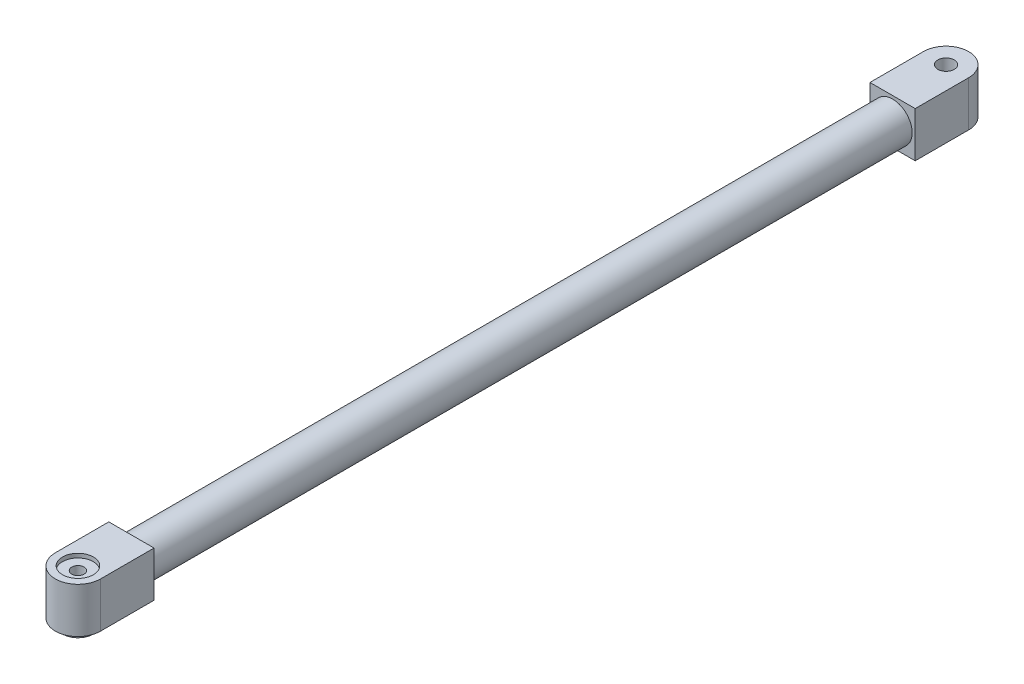
ISO-10303-21;
HEADER;
FILE_DESCRIPTION(('STEP AP214'),'2;1');
FILE_NAME('part.step','',(''),(''),'','','');
FILE_SCHEMA(('AUTOMOTIVE_DESIGN { 1 0 10303 214 1 1 1 1 }'));
ENDSEC;
DATA;
#1=APPLICATION_CONTEXT('core data for automotive mechanical design processes');
#2=APPLICATION_PROTOCOL_DEFINITION('international standard','automotive_design',2000,#1);
#3=PRODUCT_CONTEXT('',#1,'mechanical');
#4=PRODUCT('Part','Part','',(#3));
#5=PRODUCT_RELATED_PRODUCT_CATEGORY('part','',(#4));
#6=PRODUCT_DEFINITION_FORMATION('','',#4);
#7=PRODUCT_DEFINITION_CONTEXT('part definition',#1,'design');
#8=PRODUCT_DEFINITION('design','',#6,#7);
#9=PRODUCT_DEFINITION_SHAPE('','',#8);
#10=(LENGTH_UNIT() NAMED_UNIT(*) SI_UNIT(.MILLI.,.METRE.));
#11=(NAMED_UNIT(*) PLANE_ANGLE_UNIT() SI_UNIT($,.RADIAN.));
#12=(NAMED_UNIT(*) SI_UNIT($,.STERADIAN.) SOLID_ANGLE_UNIT());
#13=UNCERTAINTY_MEASURE_WITH_UNIT(LENGTH_MEASURE(1.E-05),#10,'distance_accuracy_value','');
#14=(GEOMETRIC_REPRESENTATION_CONTEXT(3) GLOBAL_UNCERTAINTY_ASSIGNED_CONTEXT((#13)) GLOBAL_UNIT_ASSIGNED_CONTEXT((#10,
#11,#12)) REPRESENTATION_CONTEXT('',''));
#15=CARTESIAN_POINT('',(0.,0.,0.));
#16=DIRECTION('',(0.,0.,1.));
#17=DIRECTION('',(1.,0.,0.));
#18=AXIS2_PLACEMENT_3D('',#15,#16,#17);
#19=CARTESIAN_POINT('',(0.,-14.,411.));
#20=DIRECTION('',(0.,1.,0.));
#21=DIRECTION('',(0.,0.,1.));
#22=AXIS2_PLACEMENT_3D('',#19,#20,#21);
#23=CYLINDRICAL_SURFACE('',#22,7.50000000000001);
#24=CARTESIAN_POINT('',(0.,-14.,411.));
#25=DIRECTION('',(0.,-1.,0.));
#26=DIRECTION('',(0.,0.,-1.));
#27=AXIS2_PLACEMENT_3D('',#24,#25,#26);
#28=CIRCLE('',#27,7.50000000000001);
#29=CARTESIAN_POINT('',(0.,-14.,403.5));
#30=VERTEX_POINT('',#29);
#31=EDGE_CURVE('E11',#30,#30,#28,.T.);
#32=ORIENTED_EDGE('',*,*,#31,.F.);
#33=EDGE_LOOP('',(#32));
#34=FACE_BOUND('',#33,.T.);
#35=CARTESIAN_POINT('',(0.,9.,411.));
#36=DIRECTION('',(0.,-1.,0.));
#37=DIRECTION('',(0.,0.,-1.));
#38=AXIS2_PLACEMENT_3D('',#35,#36,#37);
#39=CIRCLE('',#38,7.50000000000001);
#40=CARTESIAN_POINT('',(0.,9.,403.5));
#41=VERTEX_POINT('',#40);
#42=EDGE_CURVE('E54',#41,#41,#39,.T.);
#43=ORIENTED_EDGE('',*,*,#42,.T.);
#44=EDGE_LOOP('',(#43));
#45=FACE_BOUND('',#44,.T.);
#46=ADVANCED_FACE('F48',(#34,#45),#23,.T.);
#47=CARTESIAN_POINT('',(0.,-14.,411.));
#48=DIRECTION('',(0.,-1.,0.));
#49=DIRECTION('',(0.,0.,-1.));
#50=AXIS2_PLACEMENT_3D('',#47,#48,#49);
#51=PLANE('',#50);
#52=CARTESIAN_POINT('',(0.,-14.,411.));
#53=DIRECTION('',(0.,-1.,0.));
#54=DIRECTION('',(0.,0.,-1.));
#55=AXIS2_PLACEMENT_3D('',#52,#53,#54);
#56=CIRCLE('',#55,3.);
#57=CARTESIAN_POINT('',(0.,-14.,408.));
#58=VERTEX_POINT('',#57);
#59=EDGE_CURVE('E62',#58,#58,#56,.T.);
#60=ORIENTED_EDGE('',*,*,#59,.F.);
#61=EDGE_LOOP('',(#60));
#62=FACE_BOUND('',#61,.T.);
#63=ORIENTED_EDGE('',*,*,#31,.T.);
#64=EDGE_LOOP('',(#63));
#65=FACE_BOUND('',#64,.T.);
#66=ADVANCED_FACE('F71',(#62,#65),#51,.T.);
#67=CARTESIAN_POINT('',(0.,9.,411.));
#68=DIRECTION('',(0.,-1.,0.));
#69=DIRECTION('',(0.,0.,-1.));
#70=AXIS2_PLACEMENT_3D('',#67,#68,#69);
#71=PLANE('',#70);
#72=CARTESIAN_POINT('',(0.,9.,411.));
#73=DIRECTION('',(0.,-1.,0.));
#74=DIRECTION('',(0.,0.,-1.));
#75=AXIS2_PLACEMENT_3D('',#72,#73,#74);
#76=CIRCLE('',#75,3.);
#77=CARTESIAN_POINT('',(0.,9.,408.));
#78=VERTEX_POINT('',#77);
#79=EDGE_CURVE('E58',#78,#78,#76,.F.);
#80=ORIENTED_EDGE('',*,*,#79,.F.);
#81=EDGE_LOOP('',(#80));
#82=FACE_BOUND('',#81,.T.);
#83=ORIENTED_EDGE('',*,*,#42,.F.);
#84=EDGE_LOOP('',(#83));
#85=FACE_BOUND('',#84,.T.);
#86=ADVANCED_FACE('F73',(#82,#85),#71,.F.);
#87=CARTESIAN_POINT('',(0.,11.001,411.));
#88=DIRECTION('',(0.,-1.,0.));
#89=DIRECTION('',(0.,0.,-1.));
#90=AXIS2_PLACEMENT_3D('',#87,#88,#89);
#91=CYLINDRICAL_SURFACE('',#90,3.);
#92=ORIENTED_EDGE('',*,*,#59,.T.);
#93=EDGE_LOOP('',(#92));
#94=FACE_BOUND('',#93,.T.);
#95=ORIENTED_EDGE('',*,*,#79,.T.);
#96=EDGE_LOOP('',(#95));
#97=FACE_BOUND('',#96,.T.);
#98=ADVANCED_FACE('F68',(#94,#97),#91,.F.);
#99=CLOSED_SHELL('',(#46,#66,#86,#98));
#100=MANIFOLD_SOLID_BREP('B2',#99);
#101=CARTESIAN_POINT('',(11.,11.,385.));
#102=DIRECTION('',(1.,0.,0.));
#103=DIRECTION('',(0.,1.,0.));
#104=AXIS2_PLACEMENT_3D('',#101,#102,#103);
#105=PLANE('',#104);
#106=DIRECTION('',(0.,0.,1.));
#107=VECTOR('',#106,1.);
#108=CARTESIAN_POINT('',(11.,-11.,385.));
#109=LINE('',#108,#107);
#110=CARTESIAN_POINT('',(11.,-11.,385.));
#111=VERTEX_POINT('',#110);
#112=CARTESIAN_POINT('',(11.,-11.,411.));
#113=VERTEX_POINT('',#112);
#114=EDGE_CURVE('E123',#111,#113,#109,.T.);
#115=ORIENTED_EDGE('',*,*,#114,.F.);
#116=DIRECTION('',(0.,-1.,0.));
#117=VECTOR('',#116,1.);
#118=CARTESIAN_POINT('',(11.,11.,385.));
#119=LINE('',#118,#117);
#120=CARTESIAN_POINT('',(11.,11.,385.));
#121=VERTEX_POINT('',#120);
#122=EDGE_CURVE('E186',#121,#111,#119,.T.);
#123=ORIENTED_EDGE('',*,*,#122,.F.);
#124=DIRECTION('',(0.,0.,1.));
#125=VECTOR('',#124,1.);
#126=CARTESIAN_POINT('',(11.,11.,385.));
#127=LINE('',#126,#125);
#128=CARTESIAN_POINT('',(11.,11.,411.));
#129=VERTEX_POINT('',#128);
#130=EDGE_CURVE('E46',#121,#129,#127,.T.);
#131=ORIENTED_EDGE('',*,*,#130,.T.);
#132=DIRECTION('',(0.,-1.,0.));
#133=VECTOR('',#132,1.);
#134=CARTESIAN_POINT('',(11.,40.732137494637,411.));
#135=LINE('',#134,#133);
#136=EDGE_CURVE('E170',#129,#113,#135,.T.);
#137=ORIENTED_EDGE('',*,*,#136,.T.);
#138=EDGE_LOOP('',(#115,#123,#131,#137));
#139=FACE_BOUND('',#138,.T.);
#140=ADVANCED_FACE('F120',(#139),#105,.T.);
#141=CARTESIAN_POINT('',(11.,11.,385.));
#142=DIRECTION('',(0.,1.,0.));
#143=DIRECTION('',(0.,0.,-1.));
#144=AXIS2_PLACEMENT_3D('',#141,#142,#143);
#145=PLANE('',#144);
#146=CARTESIAN_POINT('',(0.,11.,411.));
#147=DIRECTION('',(0.,1.,0.));
#148=DIRECTION('',(0.,0.,1.));
#149=AXIS2_PLACEMENT_3D('',#146,#147,#148);
#150=CIRCLE('',#149,7.5);
#151=CARTESIAN_POINT('',(0.,11.,418.5));
#152=VERTEX_POINT('',#151);
#153=EDGE_CURVE('E196',#152,#152,#150,.F.);
#154=ORIENTED_EDGE('',*,*,#153,.T.);
#155=EDGE_LOOP('',(#154));
#156=FACE_BOUND('',#155,.T.);
#157=ORIENTED_EDGE('',*,*,#130,.F.);
#158=DIRECTION('',(1.,0.,0.));
#159=VECTOR('',#158,1.);
#160=CARTESIAN_POINT('',(11.,11.,385.));
#161=LINE('',#160,#159);
#162=CARTESIAN_POINT('',(-11.,11.,385.));
#163=VERTEX_POINT('',#162);
#164=EDGE_CURVE('E136',#163,#121,#161,.T.);
#165=ORIENTED_EDGE('',*,*,#164,.F.);
#166=DIRECTION('',(0.,0.,1.));
#167=VECTOR('',#166,1.);
#168=CARTESIAN_POINT('',(-11.,11.,385.));
#169=LINE('',#168,#167);
#170=CARTESIAN_POINT('',(-11.,11.,411.));
#171=VERTEX_POINT('',#170);
#172=EDGE_CURVE('E128',#163,#171,#169,.T.);
#173=ORIENTED_EDGE('',*,*,#172,.T.);
#174=CARTESIAN_POINT('',(0.,11.,411.));
#175=DIRECTION('',(0.,-1.,0.));
#176=DIRECTION('',(0.,0.,-1.));
#177=AXIS2_PLACEMENT_3D('',#174,#175,#176);
#178=CIRCLE('',#177,11.);
#179=EDGE_CURVE('E173',#171,#129,#178,.F.);
#180=ORIENTED_EDGE('',*,*,#179,.T.);
#181=EDGE_LOOP('',(#157,#165,#173,#180));
#182=FACE_BOUND('',#181,.T.);
#183=ADVANCED_FACE('F179',(#156,#182),#145,.T.);
#184=CARTESIAN_POINT('',(-11.,11.,385.));
#185=DIRECTION('',(-1.,0.,0.));
#186=DIRECTION('',(0.,-1.,0.));
#187=AXIS2_PLACEMENT_3D('',#184,#185,#186);
#188=PLANE('',#187);
#189=ORIENTED_EDGE('',*,*,#172,.F.);
#190=DIRECTION('',(0.,1.,0.));
#191=VECTOR('',#190,1.);
#192=CARTESIAN_POINT('',(-11.,11.,385.));
#193=LINE('',#192,#191);
#194=CARTESIAN_POINT('',(-11.,-11.,385.));
#195=VERTEX_POINT('',#194);
#196=EDGE_CURVE('E141',#195,#163,#193,.T.);
#197=ORIENTED_EDGE('',*,*,#196,.F.);
#198=DIRECTION('',(0.,0.,1.));
#199=VECTOR('',#198,1.);
#200=CARTESIAN_POINT('',(-11.,-11.,385.));
#201=LINE('',#200,#199);
#202=CARTESIAN_POINT('',(-11.,-11.,411.));
#203=VERTEX_POINT('',#202);
#204=EDGE_CURVE('E167',#195,#203,#201,.T.);
#205=ORIENTED_EDGE('',*,*,#204,.T.);
#206=DIRECTION('',(0.,-1.,0.));
#207=VECTOR('',#206,1.);
#208=CARTESIAN_POINT('',(-11.,40.732137494637,411.));
#209=LINE('',#208,#207);
#210=EDGE_CURVE('E162',#171,#203,#209,.T.);
#211=ORIENTED_EDGE('',*,*,#210,.F.);
#212=EDGE_LOOP('',(#189,#197,#205,#211));
#213=FACE_BOUND('',#212,.T.);
#214=ADVANCED_FACE('F164',(#213),#188,.T.);
#215=CARTESIAN_POINT('',(11.,-11.,385.));
#216=DIRECTION('',(0.,-1.,0.));
#217=DIRECTION('',(0.,0.,1.));
#218=AXIS2_PLACEMENT_3D('',#215,#216,#217);
#219=PLANE('',#218);
#220=CARTESIAN_POINT('',(0.,-11.,411.));
#221=DIRECTION('',(0.,-1.,0.));
#222=DIRECTION('',(0.,0.,-1.));
#223=AXIS2_PLACEMENT_3D('',#220,#221,#222);
#224=CIRCLE('',#223,7.5);
#225=CARTESIAN_POINT('',(0.,-11.,403.5));
#226=VERTEX_POINT('',#225);
#227=EDGE_CURVE('E177',#226,#226,#224,.T.);
#228=ORIENTED_EDGE('',*,*,#227,.F.);
#229=EDGE_LOOP('',(#228));
#230=FACE_BOUND('',#229,.T.);
#231=ORIENTED_EDGE('',*,*,#204,.F.);
#232=DIRECTION('',(-1.,0.,0.));
#233=VECTOR('',#232,1.);
#234=CARTESIAN_POINT('',(11.,-11.,385.));
#235=LINE('',#234,#233);
#236=EDGE_CURVE('E184',#111,#195,#235,.T.);
#237=ORIENTED_EDGE('',*,*,#236,.F.);
#238=ORIENTED_EDGE('',*,*,#114,.T.);
#239=CARTESIAN_POINT('',(0.,-11.,411.));
#240=DIRECTION('',(0.,1.,0.));
#241=DIRECTION('',(0.,0.,1.));
#242=AXIS2_PLACEMENT_3D('',#239,#240,#241);
#243=CIRCLE('',#242,11.);
#244=EDGE_CURVE('E169',#203,#113,#243,.T.);
#245=ORIENTED_EDGE('',*,*,#244,.F.);
#246=EDGE_LOOP('',(#231,#237,#238,#245));
#247=FACE_BOUND('',#246,.T.);
#248=ADVANCED_FACE('F204',(#230,#247),#219,.T.);
#249=CARTESIAN_POINT('',(0.,0.,385.));
#250=DIRECTION('',(0.,0.,1.));
#251=DIRECTION('',(-1.,0.,0.));
#252=AXIS2_PLACEMENT_3D('',#249,#250,#251);
#253=PLANE('',#252);
#254=CARTESIAN_POINT('',(0.,0.,385.));
#255=DIRECTION('',(0.,0.,-1.));
#256=DIRECTION('',(-1.,0.,0.));
#257=AXIS2_PLACEMENT_3D('',#254,#255,#256);
#258=CIRCLE('',#257,9.525);
#259=CARTESIAN_POINT('',(-9.525,0.,385.));
#260=VERTEX_POINT('',#259);
#261=EDGE_CURVE('E188',#260,#260,#258,.T.);
#262=ORIENTED_EDGE('',*,*,#261,.F.);
#263=EDGE_LOOP('',(#262));
#264=FACE_BOUND('',#263,.T.);
#265=ORIENTED_EDGE('',*,*,#122,.T.);
#266=ORIENTED_EDGE('',*,*,#236,.T.);
#267=ORIENTED_EDGE('',*,*,#196,.T.);
#268=ORIENTED_EDGE('',*,*,#164,.T.);
#269=EDGE_LOOP('',(#265,#266,#267,#268));
#270=FACE_BOUND('',#269,.T.);
#271=ADVANCED_FACE('F207',(#264,#270),#253,.F.);
#272=CARTESIAN_POINT('',(0.,0.,385.));
#273=DIRECTION('',(0.,0.,1.));
#274=DIRECTION('',(-1.,0.,0.));
#275=AXIS2_PLACEMENT_3D('',#272,#273,#274);
#276=CYLINDRICAL_SURFACE('',#275,9.525);
#277=ORIENTED_EDGE('',*,*,#261,.T.);
#278=EDGE_LOOP('',(#277));
#279=FACE_BOUND('',#278,.T.);
#280=CARTESIAN_POINT('',(0.,0.,400.));
#281=DIRECTION('',(0.,0.,-1.));
#282=DIRECTION('',(-1.,0.,0.));
#283=AXIS2_PLACEMENT_3D('',#280,#281,#282);
#284=CIRCLE('',#283,9.525);
#285=CARTESIAN_POINT('',(-9.525,0.,400.));
#286=VERTEX_POINT('',#285);
#287=EDGE_CURVE('E191',#286,#286,#284,.F.);
#288=ORIENTED_EDGE('',*,*,#287,.T.);
#289=EDGE_LOOP('',(#288));
#290=FACE_BOUND('',#289,.T.);
#291=ADVANCED_FACE('F213',(#279,#290),#276,.F.);
#292=CARTESIAN_POINT('',(0.,0.,400.));
#293=DIRECTION('',(0.,0.,1.));
#294=DIRECTION('',(-1.,0.,0.));
#295=AXIS2_PLACEMENT_3D('',#292,#293,#294);
#296=PLANE('',#295);
#297=ORIENTED_EDGE('',*,*,#287,.F.);
#298=EDGE_LOOP('',(#297));
#299=FACE_BOUND('',#298,.T.);
#300=ADVANCED_FACE('F219',(#299),#296,.F.);
#301=CARTESIAN_POINT('',(0.,40.732137494637,411.));
#302=DIRECTION('',(0.,-1.,0.));
#303=DIRECTION('',(0.,0.,1.));
#304=AXIS2_PLACEMENT_3D('',#301,#302,#303);
#305=CYLINDRICAL_SURFACE('',#304,11.);
#306=ORIENTED_EDGE('',*,*,#210,.T.);
#307=ORIENTED_EDGE('',*,*,#244,.T.);
#308=ORIENTED_EDGE('',*,*,#136,.F.);
#309=ORIENTED_EDGE('',*,*,#179,.F.);
#310=EDGE_LOOP('',(#306,#307,#308,#309));
#311=FACE_BOUND('',#310,.T.);
#312=ADVANCED_FACE('F174',(#311),#305,.T.);
#313=CARTESIAN_POINT('',(0.,11.001,411.));
#314=DIRECTION('',(0.,-1.,0.));
#315=DIRECTION('',(0.,0.,-1.));
#316=AXIS2_PLACEMENT_3D('',#313,#314,#315);
#317=CYLINDRICAL_SURFACE('',#316,7.5);
#318=ORIENTED_EDGE('',*,*,#153,.F.);
#319=EDGE_LOOP('',(#318));
#320=FACE_BOUND('',#319,.T.);
#321=ORIENTED_EDGE('',*,*,#227,.T.);
#322=EDGE_LOOP('',(#321));
#323=FACE_BOUND('',#322,.T.);
#324=ADVANCED_FACE('F202',(#320,#323),#317,.F.);
#325=CLOSED_SHELL('',(#140,#183,#214,#248,#271,#291,#300,#312,#324));
#326=MANIFOLD_SOLID_BREP('B6',#325);
#327=CARTESIAN_POINT('',(11.,11.,15.));
#328=DIRECTION('',(1.,0.,0.));
#329=DIRECTION('',(0.,1.,0.));
#330=AXIS2_PLACEMENT_3D('',#327,#328,#329);
#331=PLANE('',#330);
#332=DIRECTION('',(0.,0.,-1.));
#333=VECTOR('',#332,1.);
#334=CARTESIAN_POINT('',(11.,-11.,15.));
#335=LINE('',#334,#333);
#336=CARTESIAN_POINT('',(11.,-11.,15.));
#337=VERTEX_POINT('',#336);
#338=CARTESIAN_POINT('',(11.,-11.,-11.));
#339=VERTEX_POINT('',#338);
#340=EDGE_CURVE('E361',#337,#339,#335,.T.);
#341=ORIENTED_EDGE('',*,*,#340,.T.);
#342=DIRECTION('',(0.,-1.,0.));
#343=VECTOR('',#342,1.);
#344=CARTESIAN_POINT('',(11.,40.732137494637,-11.));
#345=LINE('',#344,#343);
#346=CARTESIAN_POINT('',(11.,11.,-11.));
#347=VERTEX_POINT('',#346);
#348=EDGE_CURVE('E413',#347,#339,#345,.T.);
#349=ORIENTED_EDGE('',*,*,#348,.F.);
#350=DIRECTION('',(0.,0.,-1.));
#351=VECTOR('',#350,1.);
#352=CARTESIAN_POINT('',(11.,11.,15.));
#353=LINE('',#352,#351);
#354=CARTESIAN_POINT('',(11.,11.,15.));
#355=VERTEX_POINT('',#354);
#356=EDGE_CURVE('E118',#355,#347,#353,.T.);
#357=ORIENTED_EDGE('',*,*,#356,.F.);
#358=DIRECTION('',(0.,-1.,0.));
#359=VECTOR('',#358,1.);
#360=CARTESIAN_POINT('',(11.,11.,15.));
#361=LINE('',#360,#359);
#362=EDGE_CURVE('E431',#355,#337,#361,.T.);
#363=ORIENTED_EDGE('',*,*,#362,.T.);
#364=EDGE_LOOP('',(#341,#349,#357,#363));
#365=FACE_BOUND('',#364,.T.);
#366=ADVANCED_FACE('F358',(#365),#331,.T.);
#367=CARTESIAN_POINT('',(11.,11.,15.));
#368=DIRECTION('',(0.,1.,0.));
#369=DIRECTION('',(0.,0.,1.));
#370=AXIS2_PLACEMENT_3D('',#367,#368,#369);
#371=PLANE('',#370);
#372=ORIENTED_EDGE('',*,*,#356,.T.);
#373=CARTESIAN_POINT('',(0.,11.,-11.));
#374=DIRECTION('',(0.,1.,0.));
#375=DIRECTION('',(0.,0.,1.));
#376=AXIS2_PLACEMENT_3D('',#373,#374,#375);
#377=CIRCLE('',#376,11.);
#378=CARTESIAN_POINT('',(-11.,11.,-11.));
#379=VERTEX_POINT('',#378);
#380=EDGE_CURVE('E408',#379,#347,#377,.F.);
#381=ORIENTED_EDGE('',*,*,#380,.F.);
#382=DIRECTION('',(0.,0.,-1.));
#383=VECTOR('',#382,1.);
#384=CARTESIAN_POINT('',(-11.,11.,15.));
#385=LINE('',#384,#383);
#386=CARTESIAN_POINT('',(-11.,11.,15.));
#387=VERTEX_POINT('',#386);
#388=EDGE_CURVE('E366',#387,#379,#385,.T.);
#389=ORIENTED_EDGE('',*,*,#388,.F.);
#390=DIRECTION('',(1.,0.,0.));
#391=VECTOR('',#390,1.);
#392=CARTESIAN_POINT('',(11.,11.,15.));
#393=LINE('',#392,#391);
#394=EDGE_CURVE('E437',#387,#355,#393,.T.);
#395=ORIENTED_EDGE('',*,*,#394,.T.);
#396=EDGE_LOOP('',(#372,#381,#389,#395));
#397=FACE_BOUND('',#396,.T.);
#398=CARTESIAN_POINT('',(0.,11.,-11.));
#399=DIRECTION('',(0.,1.,0.));
#400=DIRECTION('',(0.,0.,1.));
#401=AXIS2_PLACEMENT_3D('',#398,#399,#400);
#402=CIRCLE('',#401,4.);
#403=CARTESIAN_POINT('',(0.,11.,-7.));
#404=VERTEX_POINT('',#403);
#405=EDGE_CURVE('E428',#404,#404,#402,.F.);
#406=ORIENTED_EDGE('',*,*,#405,.T.);
#407=EDGE_LOOP('',(#406));
#408=FACE_BOUND('',#407,.T.);
#409=ADVANCED_FACE('F409',(#397,#408),#371,.T.);
#410=CARTESIAN_POINT('',(-11.,11.,15.));
#411=DIRECTION('',(-1.,0.,0.));
#412=DIRECTION('',(0.,-1.,0.));
#413=AXIS2_PLACEMENT_3D('',#410,#411,#412);
#414=PLANE('',#413);
#415=ORIENTED_EDGE('',*,*,#388,.T.);
#416=DIRECTION('',(0.,-1.,0.));
#417=VECTOR('',#416,1.);
#418=CARTESIAN_POINT('',(-11.,40.732137494637,-11.));
#419=LINE('',#418,#417);
#420=CARTESIAN_POINT('',(-11.,-11.,-11.));
#421=VERTEX_POINT('',#420);
#422=EDGE_CURVE('E400',#379,#421,#419,.T.);
#423=ORIENTED_EDGE('',*,*,#422,.T.);
#424=DIRECTION('',(0.,0.,-1.));
#425=VECTOR('',#424,1.);
#426=CARTESIAN_POINT('',(-11.,-11.,15.));
#427=LINE('',#426,#425);
#428=CARTESIAN_POINT('',(-11.,-11.,15.));
#429=VERTEX_POINT('',#428);
#430=EDGE_CURVE('E405',#429,#421,#427,.T.);
#431=ORIENTED_EDGE('',*,*,#430,.F.);
#432=DIRECTION('',(0.,1.,0.));
#433=VECTOR('',#432,1.);
#434=CARTESIAN_POINT('',(-11.,11.,15.));
#435=LINE('',#434,#433);
#436=EDGE_CURVE('E403',#429,#387,#435,.T.);
#437=ORIENTED_EDGE('',*,*,#436,.T.);
#438=EDGE_LOOP('',(#415,#423,#431,#437));
#439=FACE_BOUND('',#438,.T.);
#440=ADVANCED_FACE('F398',(#439),#414,.T.);
#441=CARTESIAN_POINT('',(11.,-11.,15.));
#442=DIRECTION('',(0.,-1.,0.));
#443=DIRECTION('',(0.,0.,-1.));
#444=AXIS2_PLACEMENT_3D('',#441,#442,#443);
#445=PLANE('',#444);
#446=ORIENTED_EDGE('',*,*,#430,.T.);
#447=CARTESIAN_POINT('',(0.,-11.,-11.));
#448=DIRECTION('',(0.,-1.,0.));
#449=DIRECTION('',(0.,0.,-1.));
#450=AXIS2_PLACEMENT_3D('',#447,#448,#449);
#451=CIRCLE('',#450,11.);
#452=EDGE_CURVE('E417',#421,#339,#451,.T.);
#453=ORIENTED_EDGE('',*,*,#452,.T.);
#454=ORIENTED_EDGE('',*,*,#340,.F.);
#455=DIRECTION('',(-1.,0.,0.));
#456=VECTOR('',#455,1.);
#457=CARTESIAN_POINT('',(11.,-11.,15.));
#458=LINE('',#457,#456);
#459=EDGE_CURVE('E433',#337,#429,#458,.T.);
#460=ORIENTED_EDGE('',*,*,#459,.T.);
#461=EDGE_LOOP('',(#446,#453,#454,#460));
#462=FACE_BOUND('',#461,.T.);
#463=CARTESIAN_POINT('',(0.,-11.,-11.));
#464=DIRECTION('',(0.,-1.,0.));
#465=DIRECTION('',(0.,0.,-1.));
#466=AXIS2_PLACEMENT_3D('',#463,#464,#465);
#467=CIRCLE('',#466,4.);
#468=CARTESIAN_POINT('',(0.,-11.,-15.));
#469=VERTEX_POINT('',#468);
#470=EDGE_CURVE('E418',#469,#469,#467,.T.);
#471=ORIENTED_EDGE('',*,*,#470,.F.);
#472=EDGE_LOOP('',(#471));
#473=FACE_BOUND('',#472,.T.);
#474=ADVANCED_FACE('F440',(#462,#473),#445,.T.);
#475=CARTESIAN_POINT('',(0.,0.,15.));
#476=DIRECTION('',(0.,0.,-1.));
#477=DIRECTION('',(-1.,0.,0.));
#478=AXIS2_PLACEMENT_3D('',#475,#476,#477);
#479=PLANE('',#478);
#480=CARTESIAN_POINT('',(0.,0.,15.));
#481=DIRECTION('',(0.,0.,-1.));
#482=DIRECTION('',(-1.,0.,0.));
#483=AXIS2_PLACEMENT_3D('',#480,#481,#482);
#484=CIRCLE('',#483,9.525);
#485=CARTESIAN_POINT('',(-9.525,0.,15.));
#486=VERTEX_POINT('',#485);
#487=EDGE_CURVE('E427',#486,#486,#484,.T.);
#488=ORIENTED_EDGE('',*,*,#487,.T.);
#489=EDGE_LOOP('',(#488));
#490=FACE_BOUND('',#489,.T.);
#491=ORIENTED_EDGE('',*,*,#362,.F.);
#492=ORIENTED_EDGE('',*,*,#394,.F.);
#493=ORIENTED_EDGE('',*,*,#436,.F.);
#494=ORIENTED_EDGE('',*,*,#459,.F.);
#495=EDGE_LOOP('',(#491,#492,#493,#494));
#496=FACE_BOUND('',#495,.T.);
#497=ADVANCED_FACE('F467',(#490,#496),#479,.F.);
#498=CARTESIAN_POINT('',(0.,0.,15.));
#499=DIRECTION('',(0.,0.,-1.));
#500=DIRECTION('',(-1.,0.,0.));
#501=AXIS2_PLACEMENT_3D('',#498,#499,#500);
#502=CYLINDRICAL_SURFACE('',#501,9.525);
#503=ORIENTED_EDGE('',*,*,#487,.F.);
#504=EDGE_LOOP('',(#503));
#505=FACE_BOUND('',#504,.T.);
#506=CARTESIAN_POINT('',(0.,0.,0.));
#507=DIRECTION('',(0.,0.,-1.));
#508=DIRECTION('',(-1.,0.,0.));
#509=AXIS2_PLACEMENT_3D('',#506,#507,#508);
#510=CIRCLE('',#509,9.525);
#511=CARTESIAN_POINT('',(-9.525,0.,0.));
#512=VERTEX_POINT('',#511);
#513=EDGE_CURVE('E424',#512,#512,#510,.F.);
#514=ORIENTED_EDGE('',*,*,#513,.F.);
#515=EDGE_LOOP('',(#514));
#516=FACE_BOUND('',#515,.T.);
#517=ADVANCED_FACE('F473',(#505,#516),#502,.F.);
#518=CARTESIAN_POINT('',(0.,0.,0.));
#519=DIRECTION('',(0.,0.,-1.));
#520=DIRECTION('',(-1.,0.,0.));
#521=AXIS2_PLACEMENT_3D('',#518,#519,#520);
#522=PLANE('',#521);
#523=ORIENTED_EDGE('',*,*,#513,.T.);
#524=EDGE_LOOP('',(#523));
#525=FACE_BOUND('',#524,.T.);
#526=ADVANCED_FACE('F454',(#525),#522,.F.);
#527=CARTESIAN_POINT('',(0.,40.732137494637,-11.));
#528=DIRECTION('',(0.,-1.,0.));
#529=DIRECTION('',(0.,0.,-1.));
#530=AXIS2_PLACEMENT_3D('',#527,#528,#529);
#531=CYLINDRICAL_SURFACE('',#530,11.);
#532=ORIENTED_EDGE('',*,*,#422,.F.);
#533=ORIENTED_EDGE('',*,*,#380,.T.);
#534=ORIENTED_EDGE('',*,*,#348,.T.);
#535=ORIENTED_EDGE('',*,*,#452,.F.);
#536=EDGE_LOOP('',(#532,#533,#534,#535));
#537=FACE_BOUND('',#536,.T.);
#538=ADVANCED_FACE('F415',(#537),#531,.T.);
#539=CARTESIAN_POINT('',(0.,40.732137494637,-11.));
#540=DIRECTION('',(0.,-1.,0.));
#541=DIRECTION('',(0.,0.,-1.));
#542=AXIS2_PLACEMENT_3D('',#539,#540,#541);
#543=CYLINDRICAL_SURFACE('',#542,4.);
#544=ORIENTED_EDGE('',*,*,#470,.T.);
#545=EDGE_LOOP('',(#544));
#546=FACE_BOUND('',#545,.T.);
#547=ORIENTED_EDGE('',*,*,#405,.F.);
#548=EDGE_LOOP('',(#547));
#549=FACE_BOUND('',#548,.T.);
#550=ADVANCED_FACE('F447',(#546,#549),#543,.F.);
#551=CLOSED_SHELL('',(#366,#409,#440,#474,#497,#517,#526,#538,#550));
#552=MANIFOLD_SOLID_BREP('B40',#551);
#553=CARTESIAN_POINT('',(0.,0.,400.));
#554=DIRECTION('',(0.,0.,1.));
#555=DIRECTION('',(1.,0.,0.));
#556=AXIS2_PLACEMENT_3D('',#553,#554,#555);
#557=PLANE('',#556);
#558=CARTESIAN_POINT('',(0.,0.,400.));
#559=DIRECTION('',(0.,0.,1.));
#560=DIRECTION('',(1.,0.,0.));
#561=AXIS2_PLACEMENT_3D('',#558,#559,#560);
#562=CIRCLE('',#561,9.525);
#563=CARTESIAN_POINT('',(9.525,0.,400.));
#564=VERTEX_POINT('',#563);
#565=EDGE_CURVE('E357',#564,#564,#562,.T.);
#566=ORIENTED_EDGE('',*,*,#565,.T.);
#567=EDGE_LOOP('',(#566));
#568=FACE_BOUND('',#567,.T.);
#569=CARTESIAN_POINT('',(0.,0.,400.));
#570=DIRECTION('',(0.,0.,1.));
#571=DIRECTION('',(1.,0.,0.));
#572=AXIS2_PLACEMENT_3D('',#569,#570,#571);
#573=CIRCLE('',#572,6.2738);
#574=CARTESIAN_POINT('',(6.2738,0.,400.));
#575=VERTEX_POINT('',#574);
#576=EDGE_CURVE('E573',#575,#575,#573,.T.);
#577=ORIENTED_EDGE('',*,*,#576,.F.);
#578=EDGE_LOOP('',(#577));
#579=FACE_BOUND('',#578,.T.);
#580=ADVANCED_FACE('F562',(#568,#579),#557,.T.);
#581=CARTESIAN_POINT('',(0.,0.,0.));
#582=DIRECTION('',(0.,0.,1.));
#583=DIRECTION('',(1.,0.,0.));
#584=AXIS2_PLACEMENT_3D('',#581,#582,#583);
#585=PLANE('',#584);
#586=CARTESIAN_POINT('',(0.,0.,0.));
#587=DIRECTION('',(0.,0.,1.));
#588=DIRECTION('',(1.,0.,0.));
#589=AXIS2_PLACEMENT_3D('',#586,#587,#588);
#590=CIRCLE('',#589,9.525);
#591=CARTESIAN_POINT('',(9.525,0.,0.));
#592=VERTEX_POINT('',#591);
#593=EDGE_CURVE('E566',#592,#592,#590,.T.);
#594=ORIENTED_EDGE('',*,*,#593,.F.);
#595=EDGE_LOOP('',(#594));
#596=FACE_BOUND('',#595,.T.);
#597=CARTESIAN_POINT('',(0.,0.,0.));
#598=DIRECTION('',(0.,0.,1.));
#599=DIRECTION('',(1.,0.,0.));
#600=AXIS2_PLACEMENT_3D('',#597,#598,#599);
#601=CIRCLE('',#600,6.2738);
#602=CARTESIAN_POINT('',(6.2738,0.,0.));
#603=VERTEX_POINT('',#602);
#604=EDGE_CURVE('E575',#603,#603,#601,.T.);
#605=ORIENTED_EDGE('',*,*,#604,.T.);
#606=EDGE_LOOP('',(#605));
#607=FACE_BOUND('',#606,.T.);
#608=ADVANCED_FACE('F585',(#596,#607),#585,.F.);
#609=CARTESIAN_POINT('',(0.,0.,400.));
#610=DIRECTION('',(0.,0.,-1.));
#611=DIRECTION('',(-1.,0.,0.));
#612=AXIS2_PLACEMENT_3D('',#609,#610,#611);
#613=CYLINDRICAL_SURFACE('',#612,9.525);
#614=ORIENTED_EDGE('',*,*,#565,.F.);
#615=EDGE_LOOP('',(#614));
#616=FACE_BOUND('',#615,.T.);
#617=ORIENTED_EDGE('',*,*,#593,.T.);
#618=EDGE_LOOP('',(#617));
#619=FACE_BOUND('',#618,.T.);
#620=ADVANCED_FACE('F564',(#616,#619),#613,.T.);
#621=CARTESIAN_POINT('',(0.,0.,400.));
#622=DIRECTION('',(0.,0.,-1.));
#623=DIRECTION('',(-1.,0.,0.));
#624=AXIS2_PLACEMENT_3D('',#621,#622,#623);
#625=CYLINDRICAL_SURFACE('',#624,6.2738);
#626=ORIENTED_EDGE('',*,*,#576,.T.);
#627=EDGE_LOOP('',(#626));
#628=FACE_BOUND('',#627,.T.);
#629=ORIENTED_EDGE('',*,*,#604,.F.);
#630=EDGE_LOOP('',(#629));
#631=FACE_BOUND('',#630,.T.);
#632=ADVANCED_FACE('F581',(#628,#631),#625,.F.);
#633=CLOSED_SHELL('',(#580,#608,#620,#632));
#634=MANIFOLD_SOLID_BREP('B112',#633);
#635=ADVANCED_BREP_SHAPE_REPRESENTATION('',(#18,#100,#326,#552,#634),#14);
#636=SHAPE_DEFINITION_REPRESENTATION(#9,#635);
ENDSEC;
END-ISO-10303-21;
